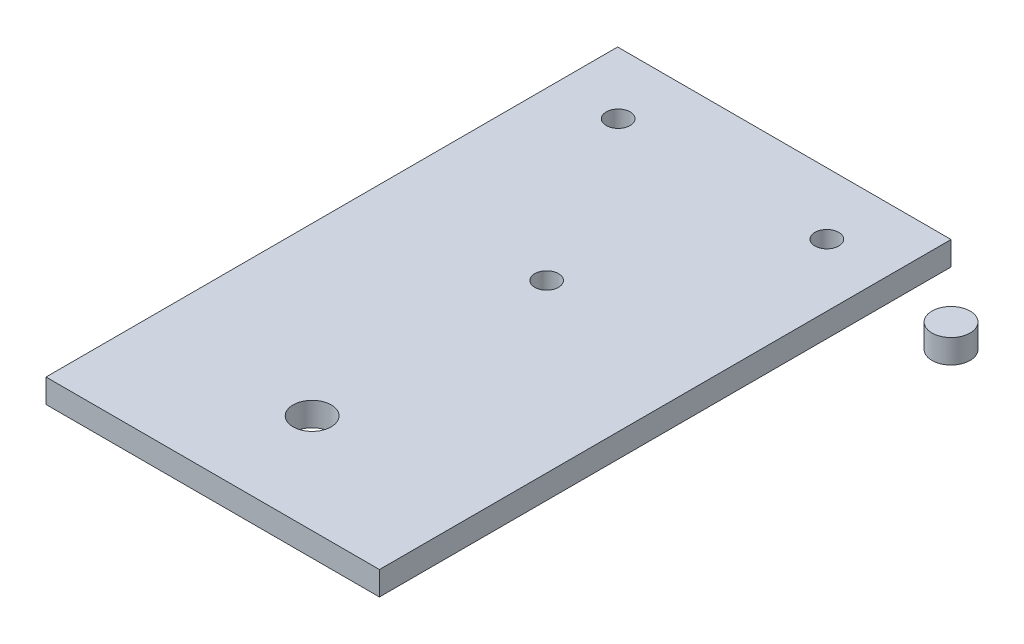
ISO-10303-21;
HEADER;
FILE_DESCRIPTION(('STEP AP214'),'2;1');
FILE_NAME('part.step','',(''),(''),'','','');
FILE_SCHEMA(('AUTOMOTIVE_DESIGN { 1 0 10303 214 1 1 1 1 }'));
ENDSEC;
DATA;
#1=APPLICATION_CONTEXT('core data for automotive mechanical design processes');
#2=APPLICATION_PROTOCOL_DEFINITION('international standard','automotive_design',2000,#1);
#3=PRODUCT_CONTEXT('',#1,'mechanical');
#4=PRODUCT('Part','Part','',(#3));
#5=PRODUCT_RELATED_PRODUCT_CATEGORY('part','',(#4));
#6=PRODUCT_DEFINITION_FORMATION('','',#4);
#7=PRODUCT_DEFINITION_CONTEXT('part definition',#1,'design');
#8=PRODUCT_DEFINITION('design','',#6,#7);
#9=PRODUCT_DEFINITION_SHAPE('','',#8);
#10=(LENGTH_UNIT() NAMED_UNIT(*) SI_UNIT(.MILLI.,.METRE.));
#11=(NAMED_UNIT(*) PLANE_ANGLE_UNIT() SI_UNIT($,.RADIAN.));
#12=(NAMED_UNIT(*) SI_UNIT($,.STERADIAN.) SOLID_ANGLE_UNIT());
#13=UNCERTAINTY_MEASURE_WITH_UNIT(LENGTH_MEASURE(1.E-05),#10,'distance_accuracy_value','');
#14=(GEOMETRIC_REPRESENTATION_CONTEXT(3) GLOBAL_UNCERTAINTY_ASSIGNED_CONTEXT((#13)) GLOBAL_UNIT_ASSIGNED_CONTEXT((#10,
#11,#12)) REPRESENTATION_CONTEXT('',''));
#15=CARTESIAN_POINT('',(0.,0.,0.));
#16=DIRECTION('',(0.,0.,1.));
#17=DIRECTION('',(1.,0.,0.));
#18=AXIS2_PLACEMENT_3D('',#15,#16,#17);
#19=CARTESIAN_POINT('',(84.999999999995,5.,12.0540098199674));
#20=DIRECTION('',(0.,-1.,0.));
#21=DIRECTION('',(0.,0.,-1.));
#22=AXIS2_PLACEMENT_3D('',#19,#20,#21);
#23=CYLINDRICAL_SURFACE('',#22,4.00000000000001);
#24=CARTESIAN_POINT('',(84.999999999995,5.,12.0540098199674));
#25=DIRECTION('',(0.,1.,0.));
#26=DIRECTION('',(0.,0.,1.));
#27=AXIS2_PLACEMENT_3D('',#24,#25,#26);
#28=CIRCLE('',#27,4.00000000000001);
#29=CARTESIAN_POINT('',(84.999999999995,5.,16.0540098199674));
#30=VERTEX_POINT('',#29);
#31=EDGE_CURVE('E11',#30,#30,#28,.T.);
#32=ORIENTED_EDGE('',*,*,#31,.F.);
#33=EDGE_LOOP('',(#32));
#34=FACE_BOUND('',#33,.T.);
#35=CARTESIAN_POINT('',(84.999999999995,0.,12.0540098199674));
#36=DIRECTION('',(0.,1.,0.));
#37=DIRECTION('',(0.,0.,1.));
#38=AXIS2_PLACEMENT_3D('',#35,#36,#37);
#39=CIRCLE('',#38,4.00000000000001);
#40=CARTESIAN_POINT('',(84.999999999995,0.,16.0540098199674));
#41=VERTEX_POINT('',#40);
#42=EDGE_CURVE('E44',#41,#41,#39,.T.);
#43=ORIENTED_EDGE('',*,*,#42,.T.);
#44=EDGE_LOOP('',(#43));
#45=FACE_BOUND('',#44,.T.);
#46=ADVANCED_FACE('F41',(#34,#45),#23,.T.);
#47=CARTESIAN_POINT('',(84.999999999995,5.,12.0540098199674));
#48=DIRECTION('',(0.,1.,0.));
#49=DIRECTION('',(0.,0.,1.));
#50=AXIS2_PLACEMENT_3D('',#47,#48,#49);
#51=PLANE('',#50);
#52=ORIENTED_EDGE('',*,*,#31,.T.);
#53=EDGE_LOOP('',(#52));
#54=FACE_BOUND('',#53,.T.);
#55=ADVANCED_FACE('F56',(#54),#51,.T.);
#56=CARTESIAN_POINT('',(84.999999999995,0.,12.0540098199674));
#57=DIRECTION('',(0.,1.,0.));
#58=DIRECTION('',(0.,0.,1.));
#59=AXIS2_PLACEMENT_3D('',#56,#57,#58);
#60=PLANE('',#59);
#61=ORIENTED_EDGE('',*,*,#42,.F.);
#62=EDGE_LOOP('',(#61));
#63=FACE_BOUND('',#62,.T.);
#64=ADVANCED_FACE('F54',(#63),#60,.F.);
#65=CLOSED_SHELL('',(#46,#55,#64));
#66=MANIFOLD_SOLID_BREP('B2',#65);
#67=CARTESIAN_POINT('',(0.,5.,0.));
#68=DIRECTION('',(0.,1.,0.));
#69=DIRECTION('',(0.,0.,1.));
#70=AXIS2_PLACEMENT_3D('',#67,#68,#69);
#71=PLANE('',#70);
#72=CARTESIAN_POINT('',(56.9021547872621,5.,10.0345740122096));
#73=DIRECTION('',(0.,1.,0.));
#74=DIRECTION('',(0.,0.,-1.));
#75=AXIS2_PLACEMENT_3D('',#72,#73,#74);
#76=CIRCLE('',#75,2.5);
#77=CARTESIAN_POINT('',(56.9021547872621,5.,7.53457401220956));
#78=VERTEX_POINT('',#77);
#79=EDGE_CURVE('E170',#78,#78,#76,.T.);
#80=ORIENTED_EDGE('',*,*,#79,.F.);
#81=EDGE_LOOP('',(#80));
#82=FACE_BOUND('',#81,.T.);
#83=CARTESIAN_POINT('',(35.,5.,96.1821852617082));
#84=DIRECTION('',(0.,1.,0.));
#85=DIRECTION('',(0.,0.,1.));
#86=AXIS2_PLACEMENT_3D('',#83,#84,#85);
#87=CIRCLE('',#86,4.00000000000001);
#88=CARTESIAN_POINT('',(35.,5.,100.182185261708));
#89=VERTEX_POINT('',#88);
#90=EDGE_CURVE('E149',#89,#89,#87,.T.);
#91=ORIENTED_EDGE('',*,*,#90,.F.);
#92=EDGE_LOOP('',(#91));
#93=FACE_BOUND('',#92,.T.);
#94=DIRECTION('',(0.,0.,1.));
#95=VECTOR('',#94,1.);
#96=CARTESIAN_POINT('',(0.,5.,-2.94599018003273));
#97=LINE('',#96,#95);
#98=CARTESIAN_POINT('',(0.,5.,-2.94599018003273));
#99=VERTEX_POINT('',#98);
#100=CARTESIAN_POINT('',(0.,5.,117.054009819967));
#101=VERTEX_POINT('',#100);
#102=EDGE_CURVE('E134',#99,#101,#97,.T.);
#103=ORIENTED_EDGE('',*,*,#102,.T.);
#104=DIRECTION('',(1.,0.,0.));
#105=VECTOR('',#104,1.);
#106=CARTESIAN_POINT('',(0.,5.,117.054009819967));
#107=LINE('',#106,#105);
#108=CARTESIAN_POINT('',(70.,5.,117.054009819967));
#109=VERTEX_POINT('',#108);
#110=EDGE_CURVE('E129',#101,#109,#107,.T.);
#111=ORIENTED_EDGE('',*,*,#110,.T.);
#112=DIRECTION('',(0.,0.,-1.));
#113=VECTOR('',#112,1.);
#114=CARTESIAN_POINT('',(70.,5.,-2.94599018003273));
#115=LINE('',#114,#113);
#116=CARTESIAN_POINT('',(70.,5.,-2.94599018003273));
#117=VERTEX_POINT('',#116);
#118=EDGE_CURVE('E132',#109,#117,#115,.T.);
#119=ORIENTED_EDGE('',*,*,#118,.T.);
#120=DIRECTION('',(-1.,0.,0.));
#121=VECTOR('',#120,1.);
#122=CARTESIAN_POINT('',(0.,5.,-2.94599018003273));
#123=LINE('',#122,#121);
#124=EDGE_CURVE('E99',#117,#99,#123,.T.);
#125=ORIENTED_EDGE('',*,*,#124,.T.);
#126=EDGE_LOOP('',(#103,#111,#119,#125));
#127=FACE_BOUND('',#126,.T.);
#128=CARTESIAN_POINT('',(13.0978452127379,5.,10.0345740122096));
#129=DIRECTION('',(0.,1.,0.));
#130=DIRECTION('',(0.,0.,1.));
#131=AXIS2_PLACEMENT_3D('',#128,#129,#130);
#132=CIRCLE('',#131,2.5);
#133=CARTESIAN_POINT('',(13.0978452127379,5.,12.5345740122096));
#134=VERTEX_POINT('',#133);
#135=EDGE_CURVE('E164',#134,#134,#132,.T.);
#136=ORIENTED_EDGE('',*,*,#135,.F.);
#137=EDGE_LOOP('',(#136));
#138=FACE_BOUND('',#137,.T.);
#139=CARTESIAN_POINT('',(35.,5.,46.957253621047));
#140=DIRECTION('',(0.,1.,0.));
#141=DIRECTION('',(0.,0.,1.));
#142=AXIS2_PLACEMENT_3D('',#139,#140,#141);
#143=CIRCLE('',#142,2.5);
#144=CARTESIAN_POINT('',(35.,5.,49.457253621047));
#145=VERTEX_POINT('',#144);
#146=EDGE_CURVE('E176',#145,#145,#143,.T.);
#147=ORIENTED_EDGE('',*,*,#146,.F.);
#148=EDGE_LOOP('',(#147));
#149=FACE_BOUND('',#148,.T.);
#150=ADVANCED_FACE('F82',(#82,#93,#127,#138,#149),#71,.T.);
#151=CARTESIAN_POINT('',(0.,0.,0.));
#152=DIRECTION('',(0.,1.,0.));
#153=DIRECTION('',(0.,0.,1.));
#154=AXIS2_PLACEMENT_3D('',#151,#152,#153);
#155=PLANE('',#154);
#156=DIRECTION('',(0.,0.,1.));
#157=VECTOR('',#156,1.);
#158=CARTESIAN_POINT('',(0.,0.,-2.94599018003273));
#159=LINE('',#158,#157);
#160=CARTESIAN_POINT('',(0.,0.,-2.94599018003273));
#161=VERTEX_POINT('',#160);
#162=CARTESIAN_POINT('',(0.,0.,117.054009819967));
#163=VERTEX_POINT('',#162);
#164=EDGE_CURVE('E146',#161,#163,#159,.T.);
#165=ORIENTED_EDGE('',*,*,#164,.F.);
#166=DIRECTION('',(-1.,0.,0.));
#167=VECTOR('',#166,1.);
#168=CARTESIAN_POINT('',(0.,0.,-2.94599018003273));
#169=LINE('',#168,#167);
#170=CARTESIAN_POINT('',(70.,0.,-2.94599018003273));
#171=VERTEX_POINT('',#170);
#172=EDGE_CURVE('E122',#171,#161,#169,.T.);
#173=ORIENTED_EDGE('',*,*,#172,.F.);
#174=DIRECTION('',(0.,0.,-1.));
#175=VECTOR('',#174,1.);
#176=CARTESIAN_POINT('',(70.,0.,-2.94599018003273));
#177=LINE('',#176,#175);
#178=CARTESIAN_POINT('',(70.,0.,117.054009819967));
#179=VERTEX_POINT('',#178);
#180=EDGE_CURVE('E116',#179,#171,#177,.T.);
#181=ORIENTED_EDGE('',*,*,#180,.F.);
#182=DIRECTION('',(1.,0.,0.));
#183=VECTOR('',#182,1.);
#184=CARTESIAN_POINT('',(0.,0.,117.054009819967));
#185=LINE('',#184,#183);
#186=EDGE_CURVE('E138',#163,#179,#185,.T.);
#187=ORIENTED_EDGE('',*,*,#186,.F.);
#188=EDGE_LOOP('',(#165,#173,#181,#187));
#189=FACE_BOUND('',#188,.T.);
#190=CARTESIAN_POINT('',(35.,0.,96.1821852617082));
#191=DIRECTION('',(0.,1.,0.));
#192=DIRECTION('',(0.,0.,1.));
#193=AXIS2_PLACEMENT_3D('',#190,#191,#192);
#194=CIRCLE('',#193,4.00000000000001);
#195=CARTESIAN_POINT('',(35.,0.,100.182185261708));
#196=VERTEX_POINT('',#195);
#197=EDGE_CURVE('E161',#196,#196,#194,.T.);
#198=ORIENTED_EDGE('',*,*,#197,.T.);
#199=EDGE_LOOP('',(#198));
#200=FACE_BOUND('',#199,.T.);
#201=CARTESIAN_POINT('',(13.0978452127379,0.,10.0345740122096));
#202=DIRECTION('',(0.,1.,0.));
#203=DIRECTION('',(0.,0.,1.));
#204=AXIS2_PLACEMENT_3D('',#201,#202,#203);
#205=CIRCLE('',#204,2.5);
#206=CARTESIAN_POINT('',(13.0978452127379,0.,12.5345740122096));
#207=VERTEX_POINT('',#206);
#208=EDGE_CURVE('E167',#207,#207,#205,.T.);
#209=ORIENTED_EDGE('',*,*,#208,.T.);
#210=EDGE_LOOP('',(#209));
#211=FACE_BOUND('',#210,.T.);
#212=CARTESIAN_POINT('',(56.9021547872621,0.,10.0345740122096));
#213=DIRECTION('',(0.,1.,0.));
#214=DIRECTION('',(0.,0.,-1.));
#215=AXIS2_PLACEMENT_3D('',#212,#213,#214);
#216=CIRCLE('',#215,2.5);
#217=CARTESIAN_POINT('',(56.9021547872621,0.,7.53457401220956));
#218=VERTEX_POINT('',#217);
#219=EDGE_CURVE('E173',#218,#218,#216,.T.);
#220=ORIENTED_EDGE('',*,*,#219,.T.);
#221=EDGE_LOOP('',(#220));
#222=FACE_BOUND('',#221,.T.);
#223=CARTESIAN_POINT('',(35.,0.,46.957253621047));
#224=DIRECTION('',(0.,1.,0.));
#225=DIRECTION('',(0.,0.,1.));
#226=AXIS2_PLACEMENT_3D('',#223,#224,#225);
#227=CIRCLE('',#226,2.5);
#228=CARTESIAN_POINT('',(35.,0.,49.457253621047));
#229=VERTEX_POINT('',#228);
#230=EDGE_CURVE('E179',#229,#229,#227,.T.);
#231=ORIENTED_EDGE('',*,*,#230,.T.);
#232=EDGE_LOOP('',(#231));
#233=FACE_BOUND('',#232,.T.);
#234=ADVANCED_FACE('F157',(#189,#200,#211,#222,#233),#155,.F.);
#235=CARTESIAN_POINT('',(0.,5.,-2.94599018003273));
#236=DIRECTION('',(1.,0.,0.));
#237=DIRECTION('',(0.,0.,-1.));
#238=AXIS2_PLACEMENT_3D('',#235,#236,#237);
#239=PLANE('',#238);
#240=ORIENTED_EDGE('',*,*,#164,.T.);
#241=DIRECTION('',(0.,-1.,0.));
#242=VECTOR('',#241,1.);
#243=CARTESIAN_POINT('',(0.,5.,117.054009819967));
#244=LINE('',#243,#242);
#245=EDGE_CURVE('E39',#101,#163,#244,.T.);
#246=ORIENTED_EDGE('',*,*,#245,.F.);
#247=ORIENTED_EDGE('',*,*,#102,.F.);
#248=DIRECTION('',(0.,-1.,0.));
#249=VECTOR('',#248,1.);
#250=CARTESIAN_POINT('',(0.,5.,-2.94599018003273));
#251=LINE('',#250,#249);
#252=EDGE_CURVE('E142',#99,#161,#251,.T.);
#253=ORIENTED_EDGE('',*,*,#252,.T.);
#254=EDGE_LOOP('',(#240,#246,#247,#253));
#255=FACE_BOUND('',#254,.T.);
#256=ADVANCED_FACE('F84',(#255),#239,.F.);
#257=CARTESIAN_POINT('',(0.,5.,117.054009819967));
#258=DIRECTION('',(0.,0.,-1.));
#259=DIRECTION('',(-1.,0.,0.));
#260=AXIS2_PLACEMENT_3D('',#257,#258,#259);
#261=PLANE('',#260);
#262=ORIENTED_EDGE('',*,*,#186,.T.);
#263=DIRECTION('',(0.,-1.,0.));
#264=VECTOR('',#263,1.);
#265=CARTESIAN_POINT('',(70.,5.,117.054009819967));
#266=LINE('',#265,#264);
#267=EDGE_CURVE('E91',#109,#179,#266,.T.);
#268=ORIENTED_EDGE('',*,*,#267,.F.);
#269=ORIENTED_EDGE('',*,*,#110,.F.);
#270=ORIENTED_EDGE('',*,*,#245,.T.);
#271=EDGE_LOOP('',(#262,#268,#269,#270));
#272=FACE_BOUND('',#271,.T.);
#273=ADVANCED_FACE('F137',(#272),#261,.F.);
#274=CARTESIAN_POINT('',(70.,5.,-2.94599018003273));
#275=DIRECTION('',(-1.,0.,0.));
#276=DIRECTION('',(0.,0.,1.));
#277=AXIS2_PLACEMENT_3D('',#274,#275,#276);
#278=PLANE('',#277);
#279=ORIENTED_EDGE('',*,*,#180,.T.);
#280=DIRECTION('',(0.,-1.,0.));
#281=VECTOR('',#280,1.);
#282=CARTESIAN_POINT('',(70.,5.,-2.94599018003273));
#283=LINE('',#282,#281);
#284=EDGE_CURVE('E139',#117,#171,#283,.T.);
#285=ORIENTED_EDGE('',*,*,#284,.F.);
#286=ORIENTED_EDGE('',*,*,#118,.F.);
#287=ORIENTED_EDGE('',*,*,#267,.T.);
#288=EDGE_LOOP('',(#279,#285,#286,#287));
#289=FACE_BOUND('',#288,.T.);
#290=ADVANCED_FACE('F140',(#289),#278,.F.);
#291=CARTESIAN_POINT('',(0.,5.,-2.94599018003273));
#292=DIRECTION('',(0.,0.,1.));
#293=DIRECTION('',(1.,0.,0.));
#294=AXIS2_PLACEMENT_3D('',#291,#292,#293);
#295=PLANE('',#294);
#296=ORIENTED_EDGE('',*,*,#172,.T.);
#297=ORIENTED_EDGE('',*,*,#252,.F.);
#298=ORIENTED_EDGE('',*,*,#124,.F.);
#299=ORIENTED_EDGE('',*,*,#284,.T.);
#300=EDGE_LOOP('',(#296,#297,#298,#299));
#301=FACE_BOUND('',#300,.T.);
#302=ADVANCED_FACE('F154',(#301),#295,.F.);
#303=CARTESIAN_POINT('',(35.,5.,96.1821852617082));
#304=DIRECTION('',(0.,-1.,0.));
#305=DIRECTION('',(0.,0.,-1.));
#306=AXIS2_PLACEMENT_3D('',#303,#304,#305);
#307=CYLINDRICAL_SURFACE('',#306,4.00000000000001);
#308=ORIENTED_EDGE('',*,*,#90,.T.);
#309=EDGE_LOOP('',(#308));
#310=FACE_BOUND('',#309,.T.);
#311=ORIENTED_EDGE('',*,*,#197,.F.);
#312=EDGE_LOOP('',(#311));
#313=FACE_BOUND('',#312,.T.);
#314=ADVANCED_FACE('F198',(#310,#313),#307,.F.);
#315=CARTESIAN_POINT('',(13.0978452127379,5.,10.0345740122096));
#316=DIRECTION('',(0.,-1.,0.));
#317=DIRECTION('',(0.,0.,-1.));
#318=AXIS2_PLACEMENT_3D('',#315,#316,#317);
#319=CYLINDRICAL_SURFACE('',#318,2.5);
#320=ORIENTED_EDGE('',*,*,#135,.T.);
#321=EDGE_LOOP('',(#320));
#322=FACE_BOUND('',#321,.T.);
#323=ORIENTED_EDGE('',*,*,#208,.F.);
#324=EDGE_LOOP('',(#323));
#325=FACE_BOUND('',#324,.T.);
#326=ADVANCED_FACE('F244',(#322,#325),#319,.F.);
#327=CARTESIAN_POINT('',(56.9021547872621,5.,10.0345740122096));
#328=DIRECTION('',(0.,-1.,0.));
#329=DIRECTION('',(0.,0.,-1.));
#330=AXIS2_PLACEMENT_3D('',#327,#328,#329);
#331=CYLINDRICAL_SURFACE('',#330,2.5);
#332=ORIENTED_EDGE('',*,*,#79,.T.);
#333=EDGE_LOOP('',(#332));
#334=FACE_BOUND('',#333,.T.);
#335=ORIENTED_EDGE('',*,*,#219,.F.);
#336=EDGE_LOOP('',(#335));
#337=FACE_BOUND('',#336,.T.);
#338=ADVANCED_FACE('F252',(#334,#337),#331,.F.);
#339=CARTESIAN_POINT('',(35.,5.,46.957253621047));
#340=DIRECTION('',(0.,-1.,0.));
#341=DIRECTION('',(0.,0.,-1.));
#342=AXIS2_PLACEMENT_3D('',#339,#340,#341);
#343=CYLINDRICAL_SURFACE('',#342,2.5);
#344=ORIENTED_EDGE('',*,*,#146,.T.);
#345=EDGE_LOOP('',(#344));
#346=FACE_BOUND('',#345,.T.);
#347=ORIENTED_EDGE('',*,*,#230,.F.);
#348=EDGE_LOOP('',(#347));
#349=FACE_BOUND('',#348,.T.);
#350=ADVANCED_FACE('F185',(#346,#349),#343,.F.);
#351=CLOSED_SHELL('',(#150,#234,#256,#273,#290,#302,#314,#326,#338,#350));
#352=MANIFOLD_SOLID_BREP('B6',#351);
#353=ADVANCED_BREP_SHAPE_REPRESENTATION('',(#18,#66,#352),#14);
#354=SHAPE_DEFINITION_REPRESENTATION(#9,#353);
ENDSEC;
END-ISO-10303-21;
